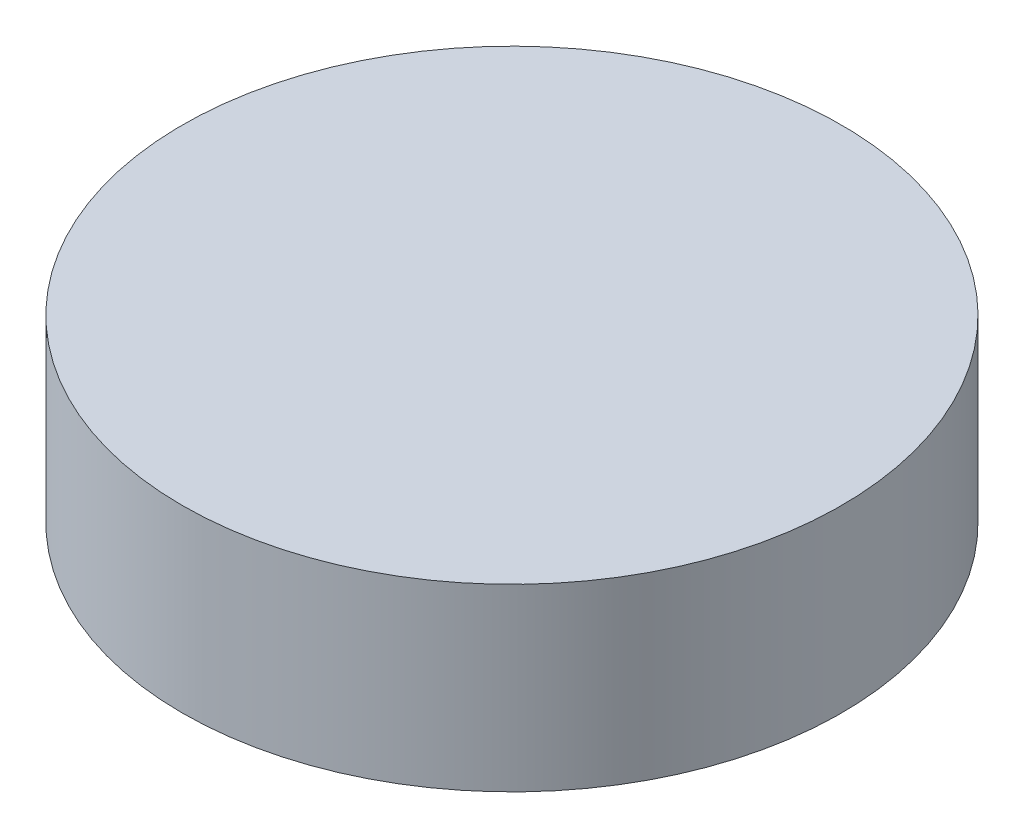
ISO-10303-21;
HEADER;
FILE_DESCRIPTION(('STEP AP214'),'2;1');
FILE_NAME('part.step','',(''),(''),'','','');
FILE_SCHEMA(('AUTOMOTIVE_DESIGN { 1 0 10303 214 1 1 1 1 }'));
ENDSEC;
DATA;
#1=APPLICATION_CONTEXT('core data for automotive mechanical design processes');
#2=APPLICATION_PROTOCOL_DEFINITION('international standard','automotive_design',2000,#1);
#3=PRODUCT_CONTEXT('',#1,'mechanical');
#4=PRODUCT('Part','Part','',(#3));
#5=PRODUCT_RELATED_PRODUCT_CATEGORY('part','',(#4));
#6=PRODUCT_DEFINITION_FORMATION('','',#4);
#7=PRODUCT_DEFINITION_CONTEXT('part definition',#1,'design');
#8=PRODUCT_DEFINITION('design','',#6,#7);
#9=PRODUCT_DEFINITION_SHAPE('','',#8);
#10=(LENGTH_UNIT() NAMED_UNIT(*) SI_UNIT(.MILLI.,.METRE.));
#11=(NAMED_UNIT(*) PLANE_ANGLE_UNIT() SI_UNIT($,.RADIAN.));
#12=(NAMED_UNIT(*) SI_UNIT($,.STERADIAN.) SOLID_ANGLE_UNIT());
#13=UNCERTAINTY_MEASURE_WITH_UNIT(LENGTH_MEASURE(1.E-05),#10,'distance_accuracy_value','');
#14=(GEOMETRIC_REPRESENTATION_CONTEXT(3) GLOBAL_UNCERTAINTY_ASSIGNED_CONTEXT((#13)) GLOBAL_UNIT_ASSIGNED_CONTEXT((#10,
#11,#12)) REPRESENTATION_CONTEXT('',''));
#15=CARTESIAN_POINT('',(0.,0.,0.));
#16=DIRECTION('',(0.,0.,1.));
#17=DIRECTION('',(1.,0.,0.));
#18=AXIS2_PLACEMENT_3D('',#15,#16,#17);
#19=CARTESIAN_POINT('',(0.,3.,0.));
#20=DIRECTION('',(0.,-1.,0.));
#21=DIRECTION('',(0.,0.,-1.));
#22=AXIS2_PLACEMENT_3D('',#19,#20,#21);
#23=CYLINDRICAL_SURFACE('',#22,5.5);
#24=CARTESIAN_POINT('',(0.,3.,0.));
#25=DIRECTION('',(0.,1.,0.));
#26=DIRECTION('',(0.,0.,1.));
#27=AXIS2_PLACEMENT_3D('',#24,#25,#26);
#28=CIRCLE('',#27,5.5);
#29=CARTESIAN_POINT('',(0.,3.,5.5));
#30=VERTEX_POINT('',#29);
#31=EDGE_CURVE('E10',#30,#30,#28,.T.);
#32=ORIENTED_EDGE('',*,*,#31,.F.);
#33=EDGE_LOOP('',(#32));
#34=FACE_BOUND('',#33,.T.);
#35=CARTESIAN_POINT('',(0.,0.,0.));
#36=DIRECTION('',(0.,1.,0.));
#37=DIRECTION('',(0.,0.,1.));
#38=AXIS2_PLACEMENT_3D('',#35,#36,#37);
#39=CIRCLE('',#38,5.5);
#40=CARTESIAN_POINT('',(0.,0.,5.5));
#41=VERTEX_POINT('',#40);
#42=EDGE_CURVE('E40',#41,#41,#39,.T.);
#43=ORIENTED_EDGE('',*,*,#42,.T.);
#44=EDGE_LOOP('',(#43));
#45=FACE_BOUND('',#44,.T.);
#46=ADVANCED_FACE('F37',(#34,#45),#23,.T.);
#47=CARTESIAN_POINT('',(0.,3.,0.));
#48=DIRECTION('',(0.,1.,0.));
#49=DIRECTION('',(0.,0.,1.));
#50=AXIS2_PLACEMENT_3D('',#47,#48,#49);
#51=PLANE('',#50);
#52=ORIENTED_EDGE('',*,*,#31,.T.);
#53=EDGE_LOOP('',(#52));
#54=FACE_BOUND('',#53,.T.);
#55=ADVANCED_FACE('F66',(#54),#51,.T.);
#56=CARTESIAN_POINT('',(0.,0.,0.));
#57=DIRECTION('',(0.,1.,0.));
#58=DIRECTION('',(0.,0.,1.));
#59=AXIS2_PLACEMENT_3D('',#56,#57,#58);
#60=PLANE('',#59);
#61=CARTESIAN_POINT('',(0.,0.,0.));
#62=DIRECTION('',(0.,-1.,0.));
#63=DIRECTION('',(0.,0.,-1.));
#64=AXIS2_PLACEMENT_3D('',#61,#62,#63);
#65=CIRCLE('',#64,2.5);
#66=CARTESIAN_POINT('',(0.,0.,-2.5));
#67=VERTEX_POINT('',#66);
#68=EDGE_CURVE('E49',#67,#67,#65,.T.);
#69=ORIENTED_EDGE('',*,*,#68,.F.);
#70=EDGE_LOOP('',(#69));
#71=FACE_BOUND('',#70,.T.);
#72=ORIENTED_EDGE('',*,*,#42,.F.);
#73=EDGE_LOOP('',(#72));
#74=FACE_BOUND('',#73,.T.);
#75=ADVANCED_FACE('F60',(#71,#74),#60,.F.);
#76=CARTESIAN_POINT('',(0.,2.,0.));
#77=DIRECTION('',(0.,-1.,0.));
#78=DIRECTION('',(0.,0.,-1.));
#79=AXIS2_PLACEMENT_3D('',#76,#77,#78);
#80=CYLINDRICAL_SURFACE('',#79,2.5);
#81=CARTESIAN_POINT('',(0.,2.,0.));
#82=DIRECTION('',(0.,-1.,0.));
#83=DIRECTION('',(0.,0.,-1.));
#84=AXIS2_PLACEMENT_3D('',#81,#82,#83);
#85=CIRCLE('',#84,2.5);
#86=CARTESIAN_POINT('',(0.,2.,-2.5));
#87=VERTEX_POINT('',#86);
#88=EDGE_CURVE('E47',#87,#87,#85,.T.);
#89=ORIENTED_EDGE('',*,*,#88,.F.);
#90=EDGE_LOOP('',(#89));
#91=FACE_BOUND('',#90,.T.);
#92=ORIENTED_EDGE('',*,*,#68,.T.);
#93=EDGE_LOOP('',(#92));
#94=FACE_BOUND('',#93,.T.);
#95=ADVANCED_FACE('F57',(#91,#94),#80,.F.);
#96=CARTESIAN_POINT('',(0.,2.,0.));
#97=DIRECTION('',(0.,-1.,0.));
#98=DIRECTION('',(0.,0.,-1.));
#99=AXIS2_PLACEMENT_3D('',#96,#97,#98);
#100=PLANE('',#99);
#101=ORIENTED_EDGE('',*,*,#88,.T.);
#102=EDGE_LOOP('',(#101));
#103=FACE_BOUND('',#102,.T.);
#104=ADVANCED_FACE('F55',(#103),#100,.T.);
#105=CLOSED_SHELL('',(#46,#55,#75,#95,#104));
#106=MANIFOLD_SOLID_BREP('B2',#105);
#107=ADVANCED_BREP_SHAPE_REPRESENTATION('',(#18,#106),#14);
#108=SHAPE_DEFINITION_REPRESENTATION(#9,#107);
ENDSEC;
END-ISO-10303-21;
